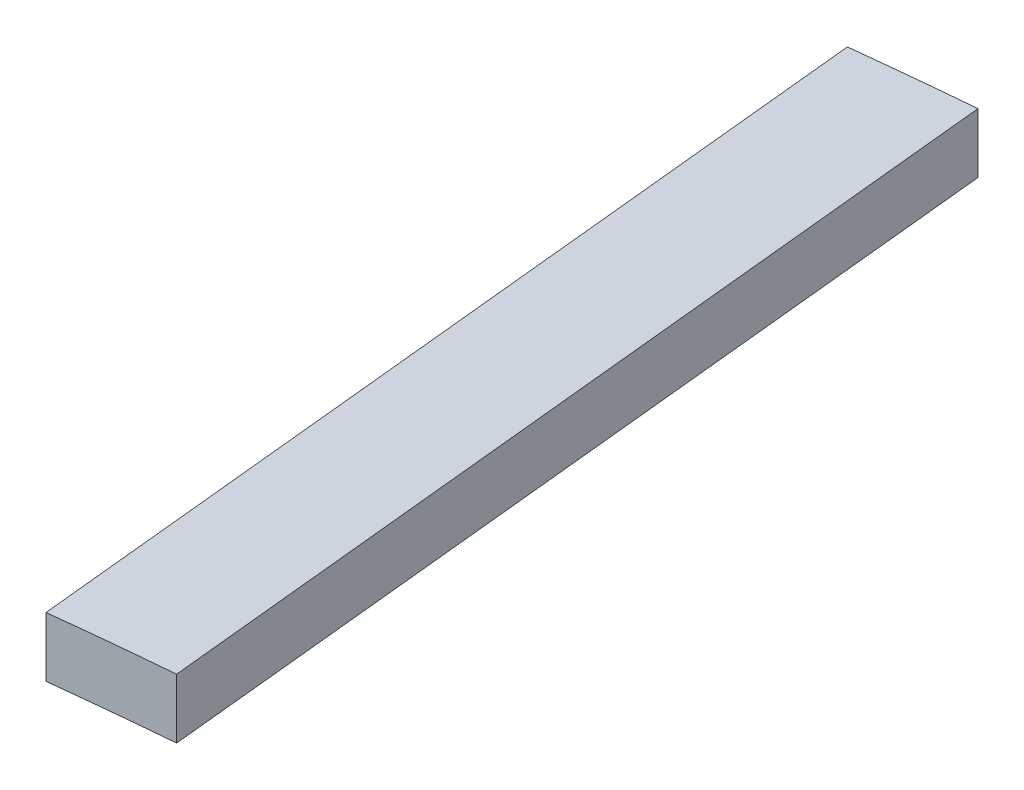
ISO-10303-21;
HEADER;
FILE_DESCRIPTION(('STEP AP214'),'2;1');
FILE_NAME('part.step','',(''),(''),'','','');
FILE_SCHEMA(('AUTOMOTIVE_DESIGN { 1 0 10303 214 1 1 1 1 }'));
ENDSEC;
DATA;
#1=APPLICATION_CONTEXT('core data for automotive mechanical design processes');
#2=APPLICATION_PROTOCOL_DEFINITION('international standard','automotive_design',2000,#1);
#3=PRODUCT_CONTEXT('',#1,'mechanical');
#4=PRODUCT('Part','Part','',(#3));
#5=PRODUCT_RELATED_PRODUCT_CATEGORY('part','',(#4));
#6=PRODUCT_DEFINITION_FORMATION('','',#4);
#7=PRODUCT_DEFINITION_CONTEXT('part definition',#1,'design');
#8=PRODUCT_DEFINITION('design','',#6,#7);
#9=PRODUCT_DEFINITION_SHAPE('','',#8);
#10=(LENGTH_UNIT() NAMED_UNIT(*) SI_UNIT(.MILLI.,.METRE.));
#11=(NAMED_UNIT(*) PLANE_ANGLE_UNIT() SI_UNIT($,.RADIAN.));
#12=(NAMED_UNIT(*) SI_UNIT($,.STERADIAN.) SOLID_ANGLE_UNIT());
#13=UNCERTAINTY_MEASURE_WITH_UNIT(LENGTH_MEASURE(1.E-05),#10,'distance_accuracy_value','');
#14=(GEOMETRIC_REPRESENTATION_CONTEXT(3) GLOBAL_UNCERTAINTY_ASSIGNED_CONTEXT((#13)) GLOBAL_UNIT_ASSIGNED_CONTEXT((#10,
#11,#12)) REPRESENTATION_CONTEXT('',''));
#15=CARTESIAN_POINT('',(0.,0.,0.));
#16=DIRECTION('',(0.,0.,1.));
#17=DIRECTION('',(1.,0.,0.));
#18=AXIS2_PLACEMENT_3D('',#15,#16,#17);
#19=CARTESIAN_POINT('',(0.,7.874,0.));
#20=DIRECTION('',(0.,1.,0.));
#21=DIRECTION('',(0.,0.,1.));
#22=AXIS2_PLACEMENT_3D('',#19,#20,#21);
#23=PLANE('',#22);
#24=CARTESIAN_POINT('',(0.,7.874,0.));
#25=DIRECTION('',(0.,1.,0.));
#26=DIRECTION('',(0.,0.,1.));
#27=AXIS2_PLACEMENT_3D('',#24,#25,#26);
#28=CIRCLE('',#27,17.997028883708);
#29=CARTESIAN_POINT('',(-2.04448475302675,7.874,-17.8805237824752));
#30=VERTEX_POINT('',#29);
#31=CARTESIAN_POINT('',(-1.53900911914113,7.874,-17.9311042485459));
#32=VERTEX_POINT('',#31);
#33=EDGE_CURVE('E78',#30,#32,#28,.F.);
#34=ORIENTED_EDGE('',*,*,#33,.T.);
#35=DIRECTION('',(0.0995678465958152,0.,0.995030775365402));
#36=VECTOR('',#35,1.);
#37=CARTESIAN_POINT('',(-1.53900911914113,7.874,-17.9311042485459));
#38=LINE('',#37,#36);
#39=CARTESIAN_POINT('',(-1.91839379914527,7.874,-21.7224831445734));
#40=VERTEX_POINT('',#39);
#41=EDGE_CURVE('E59',#32,#40,#38,.F.);
#42=ORIENTED_EDGE('',*,*,#41,.T.);
#43=CARTESIAN_POINT('',(0.,7.874,0.));
#44=DIRECTION('',(0.,1.,0.));
#45=DIRECTION('',(0.,0.,1.));
#46=AXIS2_PLACEMENT_3D('',#43,#44,#45);
#47=CIRCLE('',#46,21.807028883708);
#48=CARTESIAN_POINT('',(-2.4238694330309,7.874,-21.6719026785027));
#49=VERTEX_POINT('',#48);
#50=EDGE_CURVE('E20',#40,#49,#47,.T.);
#51=ORIENTED_EDGE('',*,*,#50,.T.);
#52=DIRECTION('',(-0.0995678465958155,0.,-0.995030775365402));
#53=VECTOR('',#52,1.);
#54=CARTESIAN_POINT('',(-2.04448475302675,7.874,-17.8805237824752));
#55=LINE('',#54,#53);
#56=EDGE_CURVE('E56',#49,#30,#55,.F.);
#57=ORIENTED_EDGE('',*,*,#56,.T.);
#58=EDGE_LOOP('',(#34,#42,#51,#57));
#59=FACE_BOUND('',#58,.T.);
#60=ADVANCED_FACE('F17',(#59),#23,.T.);
#61=CARTESIAN_POINT('',(-2.04448475302675,7.874,-17.8805237824752));
#62=DIRECTION('',(0.995030775365402,0.,-0.0995678465958155));
#63=DIRECTION('',(-0.0995678465958155,0.,-0.995030775365402));
#64=AXIS2_PLACEMENT_3D('',#61,#62,#63);
#65=PLANE('',#64);
#66=DIRECTION('',(0.,1.,0.));
#67=VECTOR('',#66,1.);
#68=CARTESIAN_POINT('',(-2.04448475302674,7.874,-17.8805237824752));
#69=LINE('',#68,#67);
#70=CARTESIAN_POINT('',(-2.04448475302675,7.62,-17.8805237824752));
#71=VERTEX_POINT('',#70);
#72=EDGE_CURVE('E66',#71,#30,#69,.T.);
#73=ORIENTED_EDGE('',*,*,#72,.T.);
#74=ORIENTED_EDGE('',*,*,#56,.F.);
#75=DIRECTION('',(0.,1.,0.));
#76=VECTOR('',#75,1.);
#77=CARTESIAN_POINT('',(-2.4238694330309,7.874,-21.6719026785027));
#78=LINE('',#77,#76);
#79=CARTESIAN_POINT('',(-2.4238694330309,7.62,-21.6719026785027));
#80=VERTEX_POINT('',#79);
#81=EDGE_CURVE('E65',#80,#49,#78,.T.);
#82=ORIENTED_EDGE('',*,*,#81,.F.);
#83=DIRECTION('',(0.0995678465958169,0.,0.995030775365401));
#84=VECTOR('',#83,1.);
#85=CARTESIAN_POINT('',(-2.4238694330309,7.62,-21.6719026785027));
#86=LINE('',#85,#84);
#87=EDGE_CURVE('E70',#80,#71,#86,.T.);
#88=ORIENTED_EDGE('',*,*,#87,.T.);
#89=EDGE_LOOP('',(#73,#74,#82,#88));
#90=FACE_BOUND('',#89,.T.);
#91=ADVANCED_FACE('F63',(#90),#65,.F.);
#92=CARTESIAN_POINT('',(0.,7.874,0.));
#93=DIRECTION('',(0.,1.,0.));
#94=DIRECTION('',(0.,0.,1.));
#95=AXIS2_PLACEMENT_3D('',#92,#93,#94);
#96=CYLINDRICAL_SURFACE('',#95,17.997028883708);
#97=DIRECTION('',(0.,1.,0.));
#98=VECTOR('',#97,1.);
#99=CARTESIAN_POINT('',(-1.53900911914113,7.874,-17.9311042485459));
#100=LINE('',#99,#98);
#101=CARTESIAN_POINT('',(-1.53900911914112,7.62,-17.9311042485459));
#102=VERTEX_POINT('',#101);
#103=EDGE_CURVE('E72',#102,#32,#100,.T.);
#104=ORIENTED_EDGE('',*,*,#103,.T.);
#105=ORIENTED_EDGE('',*,*,#33,.F.);
#106=ORIENTED_EDGE('',*,*,#72,.F.);
#107=CARTESIAN_POINT('',(0.,7.62,0.));
#108=DIRECTION('',(0.,1.,0.));
#109=DIRECTION('',(0.,0.,1.));
#110=AXIS2_PLACEMENT_3D('',#107,#108,#109);
#111=CIRCLE('',#110,17.997028883708);
#112=EDGE_CURVE('E80',#71,#102,#111,.F.);
#113=ORIENTED_EDGE('',*,*,#112,.T.);
#114=EDGE_LOOP('',(#104,#105,#106,#113));
#115=FACE_BOUND('',#114,.T.);
#116=ADVANCED_FACE('F87',(#115),#96,.F.);
#117=CARTESIAN_POINT('',(-1.53900911914113,7.874,-17.9311042485459));
#118=DIRECTION('',(-0.995030775365402,0.,0.0995678465958152));
#119=DIRECTION('',(0.0995678465958152,0.,0.995030775365402));
#120=AXIS2_PLACEMENT_3D('',#117,#118,#119);
#121=PLANE('',#120);
#122=DIRECTION('',(0.,1.,0.));
#123=VECTOR('',#122,1.);
#124=CARTESIAN_POINT('',(-1.91839379914526,7.874,-21.7224831445734));
#125=LINE('',#124,#123);
#126=CARTESIAN_POINT('',(-1.91839379914527,7.62,-21.7224831445734));
#127=VERTEX_POINT('',#126);
#128=EDGE_CURVE('E34',#40,#127,#125,.F.);
#129=ORIENTED_EDGE('',*,*,#128,.F.);
#130=ORIENTED_EDGE('',*,*,#41,.F.);
#131=ORIENTED_EDGE('',*,*,#103,.F.);
#132=DIRECTION('',(-0.099567846595817,0.,-0.995030775365401));
#133=VECTOR('',#132,1.);
#134=CARTESIAN_POINT('',(-1.53900911914112,7.62,-17.9311042485459));
#135=LINE('',#134,#133);
#136=EDGE_CURVE('E26',#102,#127,#135,.T.);
#137=ORIENTED_EDGE('',*,*,#136,.T.);
#138=EDGE_LOOP('',(#129,#130,#131,#137));
#139=FACE_BOUND('',#138,.T.);
#140=ADVANCED_FACE('F84',(#139),#121,.F.);
#141=CARTESIAN_POINT('',(0.,7.874,0.));
#142=DIRECTION('',(0.,1.,0.));
#143=DIRECTION('',(0.,0.,1.));
#144=AXIS2_PLACEMENT_3D('',#141,#142,#143);
#145=CYLINDRICAL_SURFACE('',#144,21.807028883708);
#146=ORIENTED_EDGE('',*,*,#50,.F.);
#147=ORIENTED_EDGE('',*,*,#128,.T.);
#148=CARTESIAN_POINT('',(0.,7.62,0.));
#149=DIRECTION('',(0.,1.,0.));
#150=DIRECTION('',(0.,0.,1.));
#151=AXIS2_PLACEMENT_3D('',#148,#149,#150);
#152=CIRCLE('',#151,21.807028883708);
#153=EDGE_CURVE('E11',#127,#80,#152,.T.);
#154=ORIENTED_EDGE('',*,*,#153,.T.);
#155=ORIENTED_EDGE('',*,*,#81,.T.);
#156=EDGE_LOOP('',(#146,#147,#154,#155));
#157=FACE_BOUND('',#156,.T.);
#158=ADVANCED_FACE('F68',(#157),#145,.T.);
#159=CARTESIAN_POINT('',(0.,7.62,0.));
#160=DIRECTION('',(0.,1.,0.));
#161=DIRECTION('',(0.,0.,1.));
#162=AXIS2_PLACEMENT_3D('',#159,#160,#161);
#163=PLANE('',#162);
#164=ORIENTED_EDGE('',*,*,#136,.F.);
#165=ORIENTED_EDGE('',*,*,#112,.F.);
#166=ORIENTED_EDGE('',*,*,#87,.F.);
#167=ORIENTED_EDGE('',*,*,#153,.F.);
#168=EDGE_LOOP('',(#164,#165,#166,#167));
#169=FACE_BOUND('',#168,.T.);
#170=ADVANCED_FACE('F90',(#169),#163,.F.);
#171=CLOSED_SHELL('',(#60,#91,#116,#140,#158,#170));
#172=MANIFOLD_SOLID_BREP('B1',#171);
#173=ADVANCED_BREP_SHAPE_REPRESENTATION('',(#18,#172),#14);
#174=SHAPE_DEFINITION_REPRESENTATION(#9,#173);
ENDSEC;
END-ISO-10303-21;
